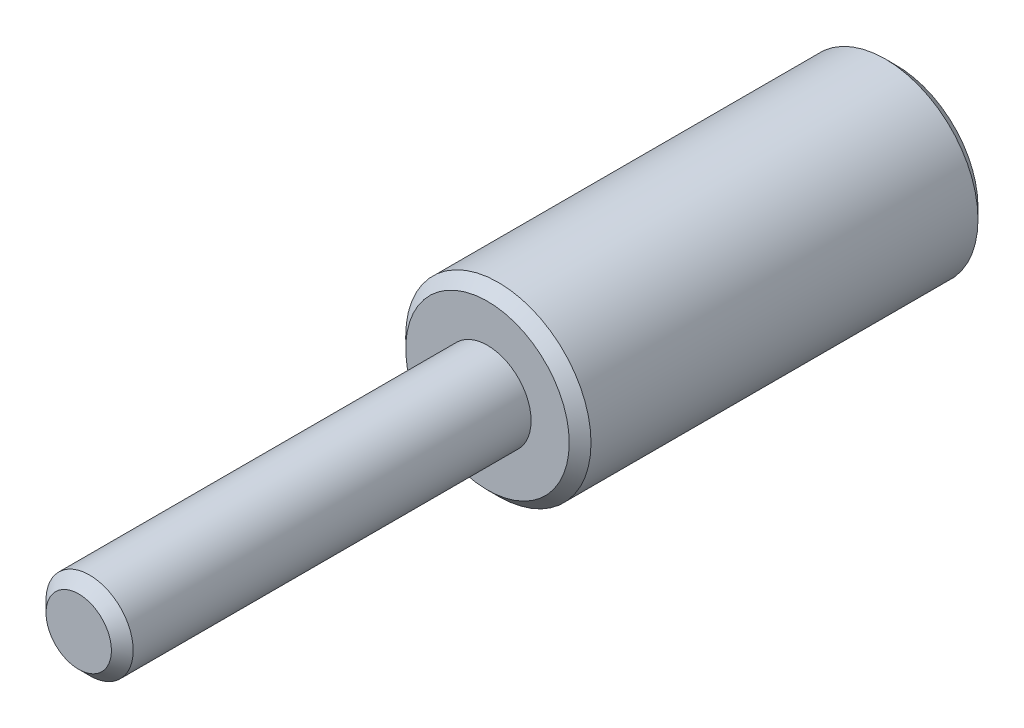
ISO-10303-21;
HEADER;
FILE_DESCRIPTION(('STEP AP214'),'2;1');
FILE_NAME('part.step','',(''),(''),'','','');
FILE_SCHEMA(('AUTOMOTIVE_DESIGN { 1 0 10303 214 1 1 1 1 }'));
ENDSEC;
DATA;
#1=APPLICATION_CONTEXT('core data for automotive mechanical design processes');
#2=APPLICATION_PROTOCOL_DEFINITION('international standard','automotive_design',2000,#1);
#3=PRODUCT_CONTEXT('',#1,'mechanical');
#4=PRODUCT('Part','Part','',(#3));
#5=PRODUCT_RELATED_PRODUCT_CATEGORY('part','',(#4));
#6=PRODUCT_DEFINITION_FORMATION('','',#4);
#7=PRODUCT_DEFINITION_CONTEXT('part definition',#1,'design');
#8=PRODUCT_DEFINITION('design','',#6,#7);
#9=PRODUCT_DEFINITION_SHAPE('','',#8);
#10=(LENGTH_UNIT() NAMED_UNIT(*) SI_UNIT(.MILLI.,.METRE.));
#11=(NAMED_UNIT(*) PLANE_ANGLE_UNIT() SI_UNIT($,.RADIAN.));
#12=(NAMED_UNIT(*) SI_UNIT($,.STERADIAN.) SOLID_ANGLE_UNIT());
#13=UNCERTAINTY_MEASURE_WITH_UNIT(LENGTH_MEASURE(1.E-05),#10,'distance_accuracy_value','');
#14=(GEOMETRIC_REPRESENTATION_CONTEXT(3) GLOBAL_UNCERTAINTY_ASSIGNED_CONTEXT((#13)) GLOBAL_UNIT_ASSIGNED_CONTEXT((#10,
#11,#12)) REPRESENTATION_CONTEXT('',''));
#15=CARTESIAN_POINT('',(0.,0.,0.));
#16=DIRECTION('',(0.,0.,1.));
#17=DIRECTION('',(1.,0.,0.));
#18=AXIS2_PLACEMENT_3D('',#15,#16,#17);
#19=CARTESIAN_POINT('',(0.,0.,75.));
#20=DIRECTION('',(0.,0.,-1.));
#21=DIRECTION('',(-1.,0.,0.));
#22=AXIS2_PLACEMENT_3D('',#19,#20,#21);
#23=CYLINDRICAL_SURFACE('',#22,17.);
#24=CARTESIAN_POINT('',(0.,0.,2.00000000000003));
#25=DIRECTION('',(0.,0.,1.));
#26=DIRECTION('',(1.,0.,0.));
#27=AXIS2_PLACEMENT_3D('',#24,#25,#26);
#28=CIRCLE('',#27,17.);
#29=CARTESIAN_POINT('',(17.,0.,2.00000000000003));
#30=VERTEX_POINT('',#29);
#31=EDGE_CURVE('E41',#30,#30,#28,.T.);
#32=ORIENTED_EDGE('',*,*,#31,.T.);
#33=EDGE_LOOP('',(#32));
#34=FACE_BOUND('',#33,.T.);
#35=CARTESIAN_POINT('',(0.,0.,73.));
#36=DIRECTION('',(0.,0.,1.));
#37=DIRECTION('',(1.,0.,0.));
#38=AXIS2_PLACEMENT_3D('',#35,#36,#37);
#39=CIRCLE('',#38,17.);
#40=CARTESIAN_POINT('',(17.,0.,73.));
#41=VERTEX_POINT('',#40);
#42=EDGE_CURVE('E45',#41,#41,#39,.F.);
#43=ORIENTED_EDGE('',*,*,#42,.T.);
#44=EDGE_LOOP('',(#43));
#45=FACE_BOUND('',#44,.T.);
#46=ADVANCED_FACE('F33',(#34,#45),#23,.T.);
#47=CARTESIAN_POINT('',(0.,0.,75.));
#48=DIRECTION('',(0.,0.,1.));
#49=DIRECTION('',(1.,0.,0.));
#50=AXIS2_PLACEMENT_3D('',#47,#48,#49);
#51=PLANE('',#50);
#52=CARTESIAN_POINT('',(0.,0.,75.));
#53=DIRECTION('',(0.,0.,1.));
#54=DIRECTION('',(1.,0.,0.));
#55=AXIS2_PLACEMENT_3D('',#52,#53,#54);
#56=CIRCLE('',#55,15.);
#57=CARTESIAN_POINT('',(15.,0.,75.));
#58=VERTEX_POINT('',#57);
#59=EDGE_CURVE('E49',#58,#58,#56,.T.);
#60=ORIENTED_EDGE('',*,*,#59,.T.);
#61=EDGE_LOOP('',(#60));
#62=FACE_BOUND('',#61,.T.);
#63=CARTESIAN_POINT('',(0.,0.,75.));
#64=DIRECTION('',(0.,0.,1.));
#65=DIRECTION('',(1.,0.,0.));
#66=AXIS2_PLACEMENT_3D('',#63,#64,#65);
#67=CIRCLE('',#66,8.);
#68=CARTESIAN_POINT('',(8.,0.,75.));
#69=VERTEX_POINT('',#68);
#70=EDGE_CURVE('E60',#69,#69,#67,.T.);
#71=ORIENTED_EDGE('',*,*,#70,.F.);
#72=EDGE_LOOP('',(#71));
#73=FACE_BOUND('',#72,.T.);
#74=ADVANCED_FACE('F66',(#62,#73),#51,.T.);
#75=CARTESIAN_POINT('',(0.,0.,0.));
#76=DIRECTION('',(0.,0.,1.));
#77=DIRECTION('',(1.,0.,0.));
#78=AXIS2_PLACEMENT_3D('',#75,#76,#77);
#79=PLANE('',#78);
#80=CARTESIAN_POINT('',(0.,0.,0.));
#81=DIRECTION('',(0.,0.,1.));
#82=DIRECTION('',(1.,0.,0.));
#83=AXIS2_PLACEMENT_3D('',#80,#81,#82);
#84=CIRCLE('',#83,15.);
#85=CARTESIAN_POINT('',(15.,0.,0.));
#86=VERTEX_POINT('',#85);
#87=EDGE_CURVE('E10',#86,#86,#84,.F.);
#88=ORIENTED_EDGE('',*,*,#87,.T.);
#89=EDGE_LOOP('',(#88));
#90=FACE_BOUND('',#89,.T.);
#91=ADVANCED_FACE('F68',(#90),#79,.F.);
#92=CARTESIAN_POINT('',(0.,0.,150.));
#93=DIRECTION('',(0.,0.,-1.));
#94=DIRECTION('',(-1.,0.,0.));
#95=AXIS2_PLACEMENT_3D('',#92,#93,#94);
#96=CYLINDRICAL_SURFACE('',#95,8.);
#97=CARTESIAN_POINT('',(0.,0.,148.));
#98=DIRECTION('',(0.,0.,1.));
#99=DIRECTION('',(1.,0.,0.));
#100=AXIS2_PLACEMENT_3D('',#97,#98,#99);
#101=CIRCLE('',#100,8.);
#102=CARTESIAN_POINT('',(8.,0.,148.));
#103=VERTEX_POINT('',#102);
#104=EDGE_CURVE('E54',#103,#103,#101,.F.);
#105=ORIENTED_EDGE('',*,*,#104,.T.);
#106=EDGE_LOOP('',(#105));
#107=FACE_BOUND('',#106,.T.);
#108=ORIENTED_EDGE('',*,*,#70,.T.);
#109=EDGE_LOOP('',(#108));
#110=FACE_BOUND('',#109,.T.);
#111=ADVANCED_FACE('F64',(#107,#110),#96,.T.);
#112=CARTESIAN_POINT('',(0.,0.,150.));
#113=DIRECTION('',(0.,0.,1.));
#114=DIRECTION('',(1.,0.,0.));
#115=AXIS2_PLACEMENT_3D('',#112,#113,#114);
#116=PLANE('',#115);
#117=CARTESIAN_POINT('',(0.,0.,150.));
#118=DIRECTION('',(0.,0.,1.));
#119=DIRECTION('',(1.,0.,0.));
#120=AXIS2_PLACEMENT_3D('',#117,#118,#119);
#121=CIRCLE('',#120,6.00000000000001);
#122=CARTESIAN_POINT('',(6.00000000000001,0.,150.));
#123=VERTEX_POINT('',#122);
#124=EDGE_CURVE('E57',#123,#123,#121,.T.);
#125=ORIENTED_EDGE('',*,*,#124,.T.);
#126=EDGE_LOOP('',(#125));
#127=FACE_BOUND('',#126,.T.);
#128=ADVANCED_FACE('F89',(#127),#116,.T.);
#129=CARTESIAN_POINT('',(0.,0.,150.));
#130=DIRECTION('',(0.,0.,-1.));
#131=DIRECTION('',(-1.,0.,0.));
#132=AXIS2_PLACEMENT_3D('',#129,#130,#131);
#133=CONICAL_SURFACE('',#132,6.00000000000001,0.785398163397447);
#134=ORIENTED_EDGE('',*,*,#104,.F.);
#135=EDGE_LOOP('',(#134));
#136=FACE_BOUND('',#135,.T.);
#137=ORIENTED_EDGE('',*,*,#124,.F.);
#138=EDGE_LOOP('',(#137));
#139=FACE_BOUND('',#138,.T.);
#140=ADVANCED_FACE('F83',(#136,#139),#133,.T.);
#141=CARTESIAN_POINT('',(0.,0.,75.));
#142=DIRECTION('',(0.,0.,-1.));
#143=DIRECTION('',(-1.,0.,0.));
#144=AXIS2_PLACEMENT_3D('',#141,#142,#143);
#145=CONICAL_SURFACE('',#144,15.,0.785398163397448);
#146=ORIENTED_EDGE('',*,*,#42,.F.);
#147=EDGE_LOOP('',(#146));
#148=FACE_BOUND('',#147,.T.);
#149=ORIENTED_EDGE('',*,*,#59,.F.);
#150=EDGE_LOOP('',(#149));
#151=FACE_BOUND('',#150,.T.);
#152=ADVANCED_FACE('F88',(#148,#151),#145,.T.);
#153=CARTESIAN_POINT('',(0.,0.,2.00000000000003));
#154=DIRECTION('',(0.,0.,1.));
#155=DIRECTION('',(1.,0.,0.));
#156=AXIS2_PLACEMENT_3D('',#153,#154,#155);
#157=CONICAL_SURFACE('',#156,17.,0.785398163397448);
#158=ORIENTED_EDGE('',*,*,#87,.F.);
#159=EDGE_LOOP('',(#158));
#160=FACE_BOUND('',#159,.T.);
#161=ORIENTED_EDGE('',*,*,#31,.F.);
#162=EDGE_LOOP('',(#161));
#163=FACE_BOUND('',#162,.T.);
#164=ADVANCED_FACE('F36',(#160,#163),#157,.T.);
#165=CLOSED_SHELL('',(#46,#74,#91,#111,#128,#140,#152,#164));
#166=MANIFOLD_SOLID_BREP('B2',#165);
#167=ADVANCED_BREP_SHAPE_REPRESENTATION('',(#18,#166),#14);
#168=SHAPE_DEFINITION_REPRESENTATION(#9,#167);
ENDSEC;
END-ISO-10303-21;
